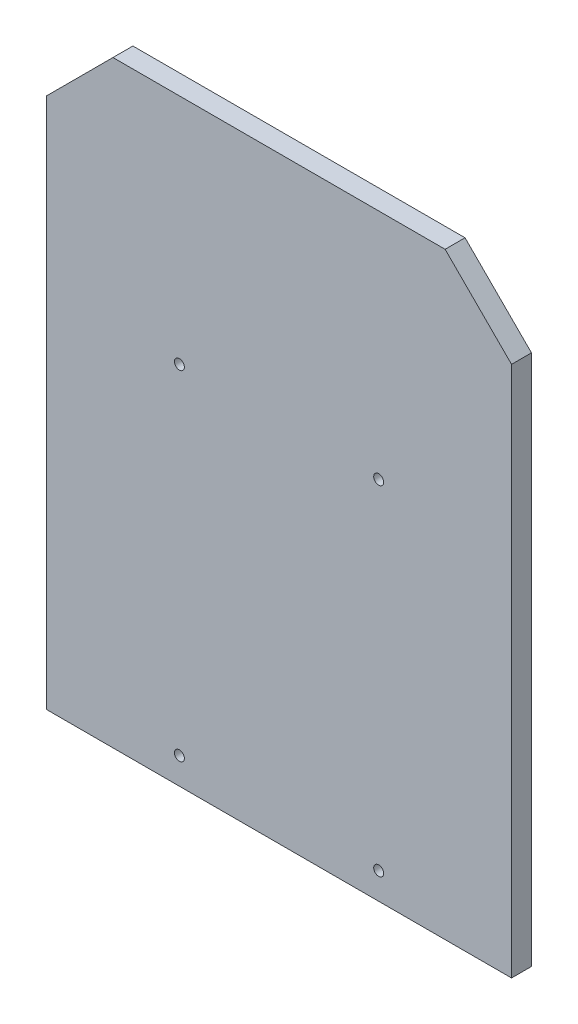
ISO-10303-21;
HEADER;
FILE_DESCRIPTION(('STEP AP214'),'2;1');
FILE_NAME('part.step','',(''),(''),'','','');
FILE_SCHEMA(('AUTOMOTIVE_DESIGN { 1 0 10303 214 1 1 1 1 }'));
ENDSEC;
DATA;
#1=APPLICATION_CONTEXT('core data for automotive mechanical design processes');
#2=APPLICATION_PROTOCOL_DEFINITION('international standard','automotive_design',2000,#1);
#3=PRODUCT_CONTEXT('',#1,'mechanical');
#4=PRODUCT('Part','Part','',(#3));
#5=PRODUCT_RELATED_PRODUCT_CATEGORY('part','',(#4));
#6=PRODUCT_DEFINITION_FORMATION('','',#4);
#7=PRODUCT_DEFINITION_CONTEXT('part definition',#1,'design');
#8=PRODUCT_DEFINITION('design','',#6,#7);
#9=PRODUCT_DEFINITION_SHAPE('','',#8);
#10=(LENGTH_UNIT() NAMED_UNIT(*) SI_UNIT(.MILLI.,.METRE.));
#11=(NAMED_UNIT(*) PLANE_ANGLE_UNIT() SI_UNIT($,.RADIAN.));
#12=(NAMED_UNIT(*) SI_UNIT($,.STERADIAN.) SOLID_ANGLE_UNIT());
#13=UNCERTAINTY_MEASURE_WITH_UNIT(LENGTH_MEASURE(1.E-05),#10,'distance_accuracy_value','');
#14=(GEOMETRIC_REPRESENTATION_CONTEXT(3) GLOBAL_UNCERTAINTY_ASSIGNED_CONTEXT((#13)) GLOBAL_UNIT_ASSIGNED_CONTEXT((#10,
#11,#12)) REPRESENTATION_CONTEXT('',''));
#15=CARTESIAN_POINT('',(0.,0.,0.));
#16=DIRECTION('',(0.,0.,1.));
#17=DIRECTION('',(1.,0.,0.));
#18=AXIS2_PLACEMENT_3D('',#15,#16,#17);
#19=CARTESIAN_POINT('',(-20.0455103864195,36.9283746556474,3.));
#20=DIRECTION('',(0.707106781186548,-0.707106781186548,0.));
#21=DIRECTION('',(0.,0.,1.));
#22=AXIS2_PLACEMENT_3D('',#19,#20,#21);
#23=PLANE('',#22);
#24=DIRECTION('',(0.,0.,1.));
#25=VECTOR('',#24,1.);
#26=CARTESIAN_POINT('',(-20.0455103864195,36.9283746556474,3.));
#27=LINE('',#26,#25);
#28=CARTESIAN_POINT('',(-20.0455103864195,36.9283746556474,0.));
#29=VERTEX_POINT('',#28);
#30=CARTESIAN_POINT('',(-20.0455103864195,36.9283746556474,3.));
#31=VERTEX_POINT('',#30);
#32=EDGE_CURVE('E132',#29,#31,#27,.T.);
#33=ORIENTED_EDGE('',*,*,#32,.F.);
#34=DIRECTION('',(-0.707106781186548,-0.707106781186548,0.));
#35=VECTOR('',#34,1.);
#36=CARTESIAN_POINT('',(-20.0455103864195,36.9283746556474,0.));
#37=LINE('',#36,#35);
#38=CARTESIAN_POINT('',(-30.0455103864195,26.9283746556474,0.));
#39=VERTEX_POINT('',#38);
#40=EDGE_CURVE('E54',#39,#29,#37,.F.);
#41=ORIENTED_EDGE('',*,*,#40,.F.);
#42=DIRECTION('',(0.,0.,-1.));
#43=VECTOR('',#42,1.);
#44=CARTESIAN_POINT('',(-30.0455103864195,26.9283746556474,3.));
#45=LINE('',#44,#43);
#46=CARTESIAN_POINT('',(-30.0455103864195,26.9283746556474,3.));
#47=VERTEX_POINT('',#46);
#48=EDGE_CURVE('E135',#47,#39,#45,.T.);
#49=ORIENTED_EDGE('',*,*,#48,.F.);
#50=DIRECTION('',(0.707106781186548,0.707106781186548,0.));
#51=VECTOR('',#50,1.);
#52=CARTESIAN_POINT('',(-28.4869425210334,28.4869425210334,3.));
#53=LINE('',#52,#51);
#54=EDGE_CURVE('E13',#31,#47,#53,.F.);
#55=ORIENTED_EDGE('',*,*,#54,.F.);
#56=EDGE_LOOP('',(#33,#41,#49,#55));
#57=FACE_BOUND('',#56,.T.);
#58=ADVANCED_FACE('F46',(#57),#23,.F.);
#59=CARTESIAN_POINT('',(39.9544896135805,26.9283746556474,3.));
#60=DIRECTION('',(-0.707106781186547,-0.707106781186548,0.));
#61=DIRECTION('',(0.,0.,1.));
#62=AXIS2_PLACEMENT_3D('',#59,#60,#61);
#63=PLANE('',#62);
#64=DIRECTION('',(0.,0.,1.));
#65=VECTOR('',#64,1.);
#66=CARTESIAN_POINT('',(39.9544896135805,26.9283746556474,3.));
#67=LINE('',#66,#65);
#68=CARTESIAN_POINT('',(39.9544896135805,26.9283746556474,0.));
#69=VERTEX_POINT('',#68);
#70=CARTESIAN_POINT('',(39.9544896135805,26.9283746556474,3.));
#71=VERTEX_POINT('',#70);
#72=EDGE_CURVE('E117',#69,#71,#67,.T.);
#73=ORIENTED_EDGE('',*,*,#72,.F.);
#74=DIRECTION('',(-0.707106781186548,0.707106781186547,0.));
#75=VECTOR('',#74,1.);
#76=CARTESIAN_POINT('',(39.9544896135805,26.9283746556474,0.));
#77=LINE('',#76,#75);
#78=CARTESIAN_POINT('',(29.9544896135805,36.9283746556474,0.));
#79=VERTEX_POINT('',#78);
#80=EDGE_CURVE('E128',#79,#69,#77,.F.);
#81=ORIENTED_EDGE('',*,*,#80,.F.);
#82=DIRECTION('',(0.,0.,-1.));
#83=VECTOR('',#82,1.);
#84=CARTESIAN_POINT('',(29.9544896135805,36.9283746556474,3.));
#85=LINE('',#84,#83);
#86=CARTESIAN_POINT('',(29.9544896135805,36.9283746556474,3.));
#87=VERTEX_POINT('',#86);
#88=EDGE_CURVE('E120',#87,#79,#85,.T.);
#89=ORIENTED_EDGE('',*,*,#88,.F.);
#90=DIRECTION('',(0.707106781186548,-0.707106781186547,0.));
#91=VECTOR('',#90,1.);
#92=CARTESIAN_POINT('',(33.441432134614,33.441432134614,3.));
#93=LINE('',#92,#91);
#94=EDGE_CURVE('E130',#71,#87,#93,.F.);
#95=ORIENTED_EDGE('',*,*,#94,.F.);
#96=EDGE_LOOP('',(#73,#81,#89,#95));
#97=FACE_BOUND('',#96,.T.);
#98=ADVANCED_FACE('F207',(#97),#63,.F.);
#99=CARTESIAN_POINT('',(-30.0455103864195,36.9283746556474,3.));
#100=DIRECTION('',(1.,0.,0.));
#101=DIRECTION('',(0.,1.,0.));
#102=AXIS2_PLACEMENT_3D('',#99,#100,#101);
#103=PLANE('',#102);
#104=DIRECTION('',(0.,-1.,0.));
#105=VECTOR('',#104,1.);
#106=CARTESIAN_POINT('',(-30.0455103864195,36.9283746556474,3.));
#107=LINE('',#106,#105);
#108=CARTESIAN_POINT('',(-30.0455103864195,-53.0716253443526,3.));
#109=VERTEX_POINT('',#108);
#110=EDGE_CURVE('E94',#47,#109,#107,.T.);
#111=ORIENTED_EDGE('',*,*,#110,.F.);
#112=ORIENTED_EDGE('',*,*,#48,.T.);
#113=DIRECTION('',(0.,-1.,0.));
#114=VECTOR('',#113,1.);
#115=CARTESIAN_POINT('',(-30.0455103864195,36.9283746556474,0.));
#116=LINE('',#115,#114);
#117=CARTESIAN_POINT('',(-30.0455103864195,-53.0716253443526,0.));
#118=VERTEX_POINT('',#117);
#119=EDGE_CURVE('E115',#39,#118,#116,.T.);
#120=ORIENTED_EDGE('',*,*,#119,.T.);
#121=DIRECTION('',(0.,0.,-1.));
#122=VECTOR('',#121,1.);
#123=CARTESIAN_POINT('',(-30.0455103864195,-53.0716253443526,3.));
#124=LINE('',#123,#122);
#125=EDGE_CURVE('E107',#109,#118,#124,.T.);
#126=ORIENTED_EDGE('',*,*,#125,.F.);
#127=EDGE_LOOP('',(#111,#112,#120,#126));
#128=FACE_BOUND('',#127,.T.);
#129=ADVANCED_FACE('F113',(#128),#103,.F.);
#130=CARTESIAN_POINT('',(-30.0455103864195,-53.0716253443526,3.));
#131=DIRECTION('',(0.,1.,0.));
#132=DIRECTION('',(0.,0.,1.));
#133=AXIS2_PLACEMENT_3D('',#130,#131,#132);
#134=PLANE('',#133);
#135=DIRECTION('',(0.,0.,-1.));
#136=VECTOR('',#135,1.);
#137=CARTESIAN_POINT('',(39.9544896135805,-53.0716253443526,3.));
#138=LINE('',#137,#136);
#139=CARTESIAN_POINT('',(39.9544896135805,-53.0716253443526,3.));
#140=VERTEX_POINT('',#139);
#141=CARTESIAN_POINT('',(39.9544896135805,-53.0716253443526,0.));
#142=VERTEX_POINT('',#141);
#143=EDGE_CURVE('E109',#140,#142,#138,.T.);
#144=ORIENTED_EDGE('',*,*,#143,.F.);
#145=DIRECTION('',(1.,0.,0.));
#146=VECTOR('',#145,1.);
#147=CARTESIAN_POINT('',(-30.0455103864195,-53.0716253443526,3.));
#148=LINE('',#147,#146);
#149=EDGE_CURVE('E98',#109,#140,#148,.T.);
#150=ORIENTED_EDGE('',*,*,#149,.F.);
#151=ORIENTED_EDGE('',*,*,#125,.T.);
#152=DIRECTION('',(1.,0.,0.));
#153=VECTOR('',#152,1.);
#154=CARTESIAN_POINT('',(-30.0455103864195,-53.0716253443526,0.));
#155=LINE('',#154,#153);
#156=EDGE_CURVE('E147',#118,#142,#155,.T.);
#157=ORIENTED_EDGE('',*,*,#156,.T.);
#158=EDGE_LOOP('',(#144,#150,#151,#157));
#159=FACE_BOUND('',#158,.T.);
#160=ADVANCED_FACE('F106',(#159),#134,.F.);
#161=CARTESIAN_POINT('',(39.9544896135805,36.9283746556474,3.));
#162=DIRECTION('',(-1.,0.,0.));
#163=DIRECTION('',(0.,-1.,0.));
#164=AXIS2_PLACEMENT_3D('',#161,#162,#163);
#165=PLANE('',#164);
#166=DIRECTION('',(0.,1.,0.));
#167=VECTOR('',#166,1.);
#168=CARTESIAN_POINT('',(39.9544896135805,36.9283746556474,0.));
#169=LINE('',#168,#167);
#170=EDGE_CURVE('E145',#142,#69,#169,.T.);
#171=ORIENTED_EDGE('',*,*,#170,.T.);
#172=ORIENTED_EDGE('',*,*,#72,.T.);
#173=DIRECTION('',(0.,1.,0.));
#174=VECTOR('',#173,1.);
#175=CARTESIAN_POINT('',(39.9544896135805,36.9283746556474,3.));
#176=LINE('',#175,#174);
#177=EDGE_CURVE('E111',#140,#71,#176,.T.);
#178=ORIENTED_EDGE('',*,*,#177,.F.);
#179=ORIENTED_EDGE('',*,*,#143,.T.);
#180=EDGE_LOOP('',(#171,#172,#178,#179));
#181=FACE_BOUND('',#180,.T.);
#182=ADVANCED_FACE('F225',(#181),#165,.F.);
#183=CARTESIAN_POINT('',(-30.0455103864195,36.9283746556474,3.));
#184=DIRECTION('',(0.,-1.,0.));
#185=DIRECTION('',(0.,0.,-1.));
#186=AXIS2_PLACEMENT_3D('',#183,#184,#185);
#187=PLANE('',#186);
#188=DIRECTION('',(-1.,0.,0.));
#189=VECTOR('',#188,1.);
#190=CARTESIAN_POINT('',(-30.0455103864195,36.9283746556474,0.));
#191=LINE('',#190,#189);
#192=EDGE_CURVE('E102',#79,#29,#191,.T.);
#193=ORIENTED_EDGE('',*,*,#192,.T.);
#194=ORIENTED_EDGE('',*,*,#32,.T.);
#195=DIRECTION('',(-1.,0.,0.));
#196=VECTOR('',#195,1.);
#197=CARTESIAN_POINT('',(-30.0455103864195,36.9283746556474,3.));
#198=LINE('',#197,#196);
#199=EDGE_CURVE('E122',#87,#31,#198,.T.);
#200=ORIENTED_EDGE('',*,*,#199,.F.);
#201=ORIENTED_EDGE('',*,*,#88,.T.);
#202=EDGE_LOOP('',(#193,#194,#200,#201));
#203=FACE_BOUND('',#202,.T.);
#204=ADVANCED_FACE('F143',(#203),#187,.F.);
#205=CARTESIAN_POINT('',(0.,0.,3.));
#206=DIRECTION('',(0.,0.,1.));
#207=DIRECTION('',(1.,0.,0.));
#208=AXIS2_PLACEMENT_3D('',#205,#206,#207);
#209=PLANE('',#208);
#210=CARTESIAN_POINT('',(19.9544896135805,1.92837465564739,3.));
#211=DIRECTION('',(0.,0.,1.));
#212=DIRECTION('',(1.,0.,0.));
#213=AXIS2_PLACEMENT_3D('',#210,#211,#212);
#214=CIRCLE('',#213,0.750000000000002);
#215=CARTESIAN_POINT('',(20.7044896135805,1.92837465564739,3.));
#216=VERTEX_POINT('',#215);
#217=EDGE_CURVE('E168',#216,#216,#214,.T.);
#218=ORIENTED_EDGE('',*,*,#217,.F.);
#219=EDGE_LOOP('',(#218));
#220=FACE_BOUND('',#219,.T.);
#221=CARTESIAN_POINT('',(-10.0455103864195,-49.0716253443526,3.));
#222=DIRECTION('',(0.,0.,1.));
#223=DIRECTION('',(1.,0.,0.));
#224=AXIS2_PLACEMENT_3D('',#221,#222,#223);
#225=CIRCLE('',#224,0.750000000000002);
#226=CARTESIAN_POINT('',(-9.29551038641947,-49.0716253443526,3.));
#227=VERTEX_POINT('',#226);
#228=EDGE_CURVE('E161',#227,#227,#225,.T.);
#229=ORIENTED_EDGE('',*,*,#228,.F.);
#230=EDGE_LOOP('',(#229));
#231=FACE_BOUND('',#230,.T.);
#232=CARTESIAN_POINT('',(19.9544896135805,-49.0716253443526,3.));
#233=DIRECTION('',(0.,0.,1.));
#234=DIRECTION('',(1.,0.,0.));
#235=AXIS2_PLACEMENT_3D('',#232,#233,#234);
#236=CIRCLE('',#235,0.749999999999999);
#237=CARTESIAN_POINT('',(20.7044896135805,-49.0716253443526,3.));
#238=VERTEX_POINT('',#237);
#239=EDGE_CURVE('E173',#238,#238,#236,.T.);
#240=ORIENTED_EDGE('',*,*,#239,.F.);
#241=EDGE_LOOP('',(#240));
#242=FACE_BOUND('',#241,.T.);
#243=CARTESIAN_POINT('',(-10.0455103864195,1.92837465564739,3.));
#244=DIRECTION('',(0.,0.,1.));
#245=DIRECTION('',(1.,0.,0.));
#246=AXIS2_PLACEMENT_3D('',#243,#244,#245);
#247=CIRCLE('',#246,0.750000000000002);
#248=CARTESIAN_POINT('',(-9.29551038641947,1.92837465564739,3.));
#249=VERTEX_POINT('',#248);
#250=EDGE_CURVE('E155',#249,#249,#247,.T.);
#251=ORIENTED_EDGE('',*,*,#250,.F.);
#252=EDGE_LOOP('',(#251));
#253=FACE_BOUND('',#252,.T.);
#254=ORIENTED_EDGE('',*,*,#149,.T.);
#255=ORIENTED_EDGE('',*,*,#177,.T.);
#256=ORIENTED_EDGE('',*,*,#94,.T.);
#257=ORIENTED_EDGE('',*,*,#199,.T.);
#258=ORIENTED_EDGE('',*,*,#54,.T.);
#259=ORIENTED_EDGE('',*,*,#110,.T.);
#260=EDGE_LOOP('',(#254,#255,#256,#257,#258,#259));
#261=FACE_BOUND('',#260,.T.);
#262=ADVANCED_FACE('F96',(#220,#231,#242,#253,#261),#209,.T.);
#263=CARTESIAN_POINT('',(0.,0.,0.));
#264=DIRECTION('',(0.,0.,1.));
#265=DIRECTION('',(1.,0.,0.));
#266=AXIS2_PLACEMENT_3D('',#263,#264,#265);
#267=PLANE('',#266);
#268=CARTESIAN_POINT('',(19.9544896135805,1.92837465564739,0.));
#269=DIRECTION('',(0.,0.,1.));
#270=DIRECTION('',(1.,0.,0.));
#271=AXIS2_PLACEMENT_3D('',#268,#269,#270);
#272=CIRCLE('',#271,0.750000000000002);
#273=CARTESIAN_POINT('',(20.7044896135805,1.92837465564739,0.));
#274=VERTEX_POINT('',#273);
#275=EDGE_CURVE('E158',#274,#274,#272,.T.);
#276=ORIENTED_EDGE('',*,*,#275,.T.);
#277=EDGE_LOOP('',(#276));
#278=FACE_BOUND('',#277,.T.);
#279=CARTESIAN_POINT('',(-10.0455103864195,-49.0716253443526,0.));
#280=DIRECTION('',(0.,0.,1.));
#281=DIRECTION('',(1.,0.,0.));
#282=AXIS2_PLACEMENT_3D('',#279,#280,#281);
#283=CIRCLE('',#282,0.750000000000002);
#284=CARTESIAN_POINT('',(-9.29551038641947,-49.0716253443526,0.));
#285=VERTEX_POINT('',#284);
#286=EDGE_CURVE('E164',#285,#285,#283,.T.);
#287=ORIENTED_EDGE('',*,*,#286,.T.);
#288=EDGE_LOOP('',(#287));
#289=FACE_BOUND('',#288,.T.);
#290=CARTESIAN_POINT('',(19.9544896135805,-49.0716253443526,0.));
#291=DIRECTION('',(0.,0.,1.));
#292=DIRECTION('',(1.,0.,0.));
#293=AXIS2_PLACEMENT_3D('',#290,#291,#292);
#294=CIRCLE('',#293,0.749999999999999);
#295=CARTESIAN_POINT('',(20.7044896135805,-49.0716253443526,0.));
#296=VERTEX_POINT('',#295);
#297=EDGE_CURVE('E165',#296,#296,#294,.T.);
#298=ORIENTED_EDGE('',*,*,#297,.T.);
#299=EDGE_LOOP('',(#298));
#300=FACE_BOUND('',#299,.T.);
#301=CARTESIAN_POINT('',(-10.0455103864195,1.92837465564739,0.));
#302=DIRECTION('',(0.,0.,1.));
#303=DIRECTION('',(1.,0.,0.));
#304=AXIS2_PLACEMENT_3D('',#301,#302,#303);
#305=CIRCLE('',#304,0.750000000000002);
#306=CARTESIAN_POINT('',(-9.29551038641947,1.92837465564739,0.));
#307=VERTEX_POINT('',#306);
#308=EDGE_CURVE('E152',#307,#307,#305,.T.);
#309=ORIENTED_EDGE('',*,*,#308,.T.);
#310=EDGE_LOOP('',(#309));
#311=FACE_BOUND('',#310,.T.);
#312=ORIENTED_EDGE('',*,*,#170,.F.);
#313=ORIENTED_EDGE('',*,*,#156,.F.);
#314=ORIENTED_EDGE('',*,*,#119,.F.);
#315=ORIENTED_EDGE('',*,*,#40,.T.);
#316=ORIENTED_EDGE('',*,*,#192,.F.);
#317=ORIENTED_EDGE('',*,*,#80,.T.);
#318=EDGE_LOOP('',(#312,#313,#314,#315,#316,#317));
#319=FACE_BOUND('',#318,.T.);
#320=ADVANCED_FACE('F139',(#278,#289,#300,#311,#319),#267,.F.);
#321=CARTESIAN_POINT('',(-10.0455103864195,1.92837465564739,0.));
#322=DIRECTION('',(0.,0.,1.));
#323=DIRECTION('',(1.,0.,0.));
#324=AXIS2_PLACEMENT_3D('',#321,#322,#323);
#325=CYLINDRICAL_SURFACE('',#324,0.750000000000002);
#326=ORIENTED_EDGE('',*,*,#308,.F.);
#327=EDGE_LOOP('',(#326));
#328=FACE_BOUND('',#327,.T.);
#329=ORIENTED_EDGE('',*,*,#250,.T.);
#330=EDGE_LOOP('',(#329));
#331=FACE_BOUND('',#330,.T.);
#332=ADVANCED_FACE('F185',(#328,#331),#325,.F.);
#333=CARTESIAN_POINT('',(19.9544896135805,-49.0716253443526,0.));
#334=DIRECTION('',(0.,0.,1.));
#335=DIRECTION('',(1.,0.,0.));
#336=AXIS2_PLACEMENT_3D('',#333,#334,#335);
#337=CYLINDRICAL_SURFACE('',#336,0.749999999999999);
#338=ORIENTED_EDGE('',*,*,#297,.F.);
#339=EDGE_LOOP('',(#338));
#340=FACE_BOUND('',#339,.T.);
#341=ORIENTED_EDGE('',*,*,#239,.T.);
#342=EDGE_LOOP('',(#341));
#343=FACE_BOUND('',#342,.T.);
#344=ADVANCED_FACE('F181',(#340,#343),#337,.F.);
#345=CARTESIAN_POINT('',(-10.0455103864195,-49.0716253443526,0.));
#346=DIRECTION('',(0.,0.,1.));
#347=DIRECTION('',(1.,0.,0.));
#348=AXIS2_PLACEMENT_3D('',#345,#346,#347);
#349=CYLINDRICAL_SURFACE('',#348,0.750000000000002);
#350=ORIENTED_EDGE('',*,*,#286,.F.);
#351=EDGE_LOOP('',(#350));
#352=FACE_BOUND('',#351,.T.);
#353=ORIENTED_EDGE('',*,*,#228,.T.);
#354=EDGE_LOOP('',(#353));
#355=FACE_BOUND('',#354,.T.);
#356=ADVANCED_FACE('F184',(#352,#355),#349,.F.);
#357=CARTESIAN_POINT('',(19.9544896135805,1.92837465564739,0.));
#358=DIRECTION('',(0.,0.,1.));
#359=DIRECTION('',(1.,0.,0.));
#360=AXIS2_PLACEMENT_3D('',#357,#358,#359);
#361=CYLINDRICAL_SURFACE('',#360,0.750000000000002);
#362=ORIENTED_EDGE('',*,*,#275,.F.);
#363=EDGE_LOOP('',(#362));
#364=FACE_BOUND('',#363,.T.);
#365=ORIENTED_EDGE('',*,*,#217,.T.);
#366=EDGE_LOOP('',(#365));
#367=FACE_BOUND('',#366,.T.);
#368=ADVANCED_FACE('F263',(#364,#367),#361,.F.);
#369=CLOSED_SHELL('',(#58,#98,#129,#160,#182,#204,#262,#320,#332,#344,#356,#368));
#370=MANIFOLD_SOLID_BREP('B2',#369);
#371=ADVANCED_BREP_SHAPE_REPRESENTATION('',(#18,#370),#14);
#372=SHAPE_DEFINITION_REPRESENTATION(#9,#371);
ENDSEC;
END-ISO-10303-21;
